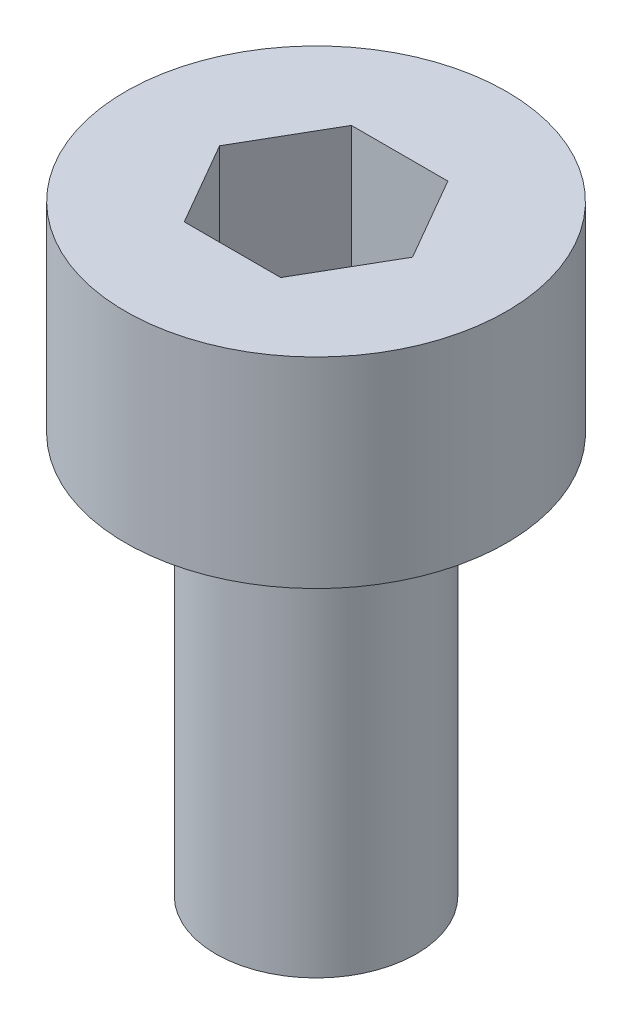
ISO-10303-21;
HEADER;
FILE_DESCRIPTION(('STEP AP214'),'2;1');
FILE_NAME('part.step','',(''),(''),'','','');
FILE_SCHEMA(('AUTOMOTIVE_DESIGN { 1 0 10303 214 1 1 1 1 }'));
ENDSEC;
DATA;
#1=APPLICATION_CONTEXT('core data for automotive mechanical design processes');
#2=APPLICATION_PROTOCOL_DEFINITION('international standard','automotive_design',2000,#1);
#3=PRODUCT_CONTEXT('',#1,'mechanical');
#4=PRODUCT('Part','Part','',(#3));
#5=PRODUCT_RELATED_PRODUCT_CATEGORY('part','',(#4));
#6=PRODUCT_DEFINITION_FORMATION('','',#4);
#7=PRODUCT_DEFINITION_CONTEXT('part definition',#1,'design');
#8=PRODUCT_DEFINITION('design','',#6,#7);
#9=PRODUCT_DEFINITION_SHAPE('','',#8);
#10=(LENGTH_UNIT() NAMED_UNIT(*) SI_UNIT(.MILLI.,.METRE.));
#11=(NAMED_UNIT(*) PLANE_ANGLE_UNIT() SI_UNIT($,.RADIAN.));
#12=(NAMED_UNIT(*) SI_UNIT($,.STERADIAN.) SOLID_ANGLE_UNIT());
#13=UNCERTAINTY_MEASURE_WITH_UNIT(LENGTH_MEASURE(1.E-05),#10,'distance_accuracy_value','');
#14=(GEOMETRIC_REPRESENTATION_CONTEXT(3) GLOBAL_UNCERTAINTY_ASSIGNED_CONTEXT((#13)) GLOBAL_UNIT_ASSIGNED_CONTEXT((#10,
#11,#12)) REPRESENTATION_CONTEXT('',''));
#15=CARTESIAN_POINT('',(0.,0.,0.));
#16=DIRECTION('',(0.,0.,1.));
#17=DIRECTION('',(1.,0.,0.));
#18=AXIS2_PLACEMENT_3D('',#15,#16,#17);
#19=CARTESIAN_POINT('',(0.,-6.,0.));
#20=DIRECTION('',(0.,-1.,0.));
#21=DIRECTION('',(0.,0.,-1.));
#22=AXIS2_PLACEMENT_3D('',#19,#20,#21);
#23=PLANE('',#22);
#24=CARTESIAN_POINT('',(0.,-6.,0.));
#25=DIRECTION('',(0.,-1.,0.));
#26=DIRECTION('',(0.,0.,-1.));
#27=AXIS2_PLACEMENT_3D('',#24,#25,#26);
#28=CIRCLE('',#27,1.5);
#29=CARTESIAN_POINT('',(0.,-6.,-1.5));
#30=VERTEX_POINT('',#29);
#31=EDGE_CURVE('E11',#30,#30,#28,.T.);
#32=ORIENTED_EDGE('',*,*,#31,.T.);
#33=EDGE_LOOP('',(#32));
#34=FACE_BOUND('',#33,.T.);
#35=ADVANCED_FACE('F36',(#34),#23,.T.);
#36=CARTESIAN_POINT('',(0.,4.,0.));
#37=DIRECTION('',(0.,-1.,0.));
#38=DIRECTION('',(0.,0.,-1.));
#39=AXIS2_PLACEMENT_3D('',#36,#37,#38);
#40=CYLINDRICAL_SURFACE('',#39,1.5);
#41=CARTESIAN_POINT('',(0.,0.,0.));
#42=DIRECTION('',(0.,-1.,0.));
#43=DIRECTION('',(0.,0.,-1.));
#44=AXIS2_PLACEMENT_3D('',#41,#42,#43);
#45=CIRCLE('',#44,1.5);
#46=CARTESIAN_POINT('',(0.,0.,-1.5));
#47=VERTEX_POINT('',#46);
#48=EDGE_CURVE('E43',#47,#47,#45,.T.);
#49=ORIENTED_EDGE('',*,*,#48,.T.);
#50=EDGE_LOOP('',(#49));
#51=FACE_BOUND('',#50,.T.);
#52=ORIENTED_EDGE('',*,*,#31,.F.);
#53=EDGE_LOOP('',(#52));
#54=FACE_BOUND('',#53,.T.);
#55=ADVANCED_FACE('F150',(#51,#54),#40,.T.);
#56=CARTESIAN_POINT('',(0.,0.,-1.5));
#57=DIRECTION('',(0.,-1.,0.));
#58=DIRECTION('',(0.,0.,-1.));
#59=AXIS2_PLACEMENT_3D('',#56,#57,#58);
#60=PLANE('',#59);
#61=CARTESIAN_POINT('',(0.,0.,0.));
#62=DIRECTION('',(0.,-1.,0.));
#63=DIRECTION('',(0.,0.,-1.));
#64=AXIS2_PLACEMENT_3D('',#61,#62,#63);
#65=CIRCLE('',#64,2.85);
#66=CARTESIAN_POINT('',(0.,0.,-2.85));
#67=VERTEX_POINT('',#66);
#68=EDGE_CURVE('E145',#67,#67,#65,.T.);
#69=ORIENTED_EDGE('',*,*,#68,.T.);
#70=EDGE_LOOP('',(#69));
#71=FACE_BOUND('',#70,.T.);
#72=ORIENTED_EDGE('',*,*,#48,.F.);
#73=EDGE_LOOP('',(#72));
#74=FACE_BOUND('',#73,.T.);
#75=ADVANCED_FACE('F153',(#71,#74),#60,.T.);
#76=CARTESIAN_POINT('',(0.,4.,0.));
#77=DIRECTION('',(0.,-1.,0.));
#78=DIRECTION('',(0.,0.,-1.));
#79=AXIS2_PLACEMENT_3D('',#76,#77,#78);
#80=CYLINDRICAL_SURFACE('',#79,2.85);
#81=CARTESIAN_POINT('',(0.,3.,0.));
#82=DIRECTION('',(0.,-1.,0.));
#83=DIRECTION('',(0.,0.,-1.));
#84=AXIS2_PLACEMENT_3D('',#81,#82,#83);
#85=CIRCLE('',#84,2.85);
#86=CARTESIAN_POINT('',(0.,3.,-2.85));
#87=VERTEX_POINT('',#86);
#88=EDGE_CURVE('E137',#87,#87,#85,.T.);
#89=ORIENTED_EDGE('',*,*,#88,.T.);
#90=EDGE_LOOP('',(#89));
#91=FACE_BOUND('',#90,.T.);
#92=ORIENTED_EDGE('',*,*,#68,.F.);
#93=EDGE_LOOP('',(#92));
#94=FACE_BOUND('',#93,.T.);
#95=ADVANCED_FACE('F155',(#91,#94),#80,.T.);
#96=CARTESIAN_POINT('',(0.,3.,-2.85));
#97=DIRECTION('',(0.,1.,0.));
#98=DIRECTION('',(0.,0.,1.));
#99=AXIS2_PLACEMENT_3D('',#96,#97,#98);
#100=PLANE('',#99);
#101=DIRECTION('',(0.5,0.,-0.866025403784439));
#102=VECTOR('',#101,1.);
#103=CARTESIAN_POINT('',(0.721687836487032,3.,1.25));
#104=LINE('',#103,#102);
#105=CARTESIAN_POINT('',(0.721687836487032,3.,1.25));
#106=VERTEX_POINT('',#105);
#107=CARTESIAN_POINT('',(1.44337567297407,3.,0.));
#108=VERTEX_POINT('',#107);
#109=EDGE_CURVE('E50',#106,#108,#104,.T.);
#110=ORIENTED_EDGE('',*,*,#109,.F.);
#111=DIRECTION('',(1.,0.,0.));
#112=VECTOR('',#111,1.);
#113=CARTESIAN_POINT('',(-0.721687836487033,3.,1.25));
#114=LINE('',#113,#112);
#115=CARTESIAN_POINT('',(-0.721687836487033,3.,1.25));
#116=VERTEX_POINT('',#115);
#117=EDGE_CURVE('E133',#116,#106,#114,.T.);
#118=ORIENTED_EDGE('',*,*,#117,.F.);
#119=DIRECTION('',(0.5,0.,0.866025403784439));
#120=VECTOR('',#119,1.);
#121=CARTESIAN_POINT('',(-1.44337567297407,3.,0.));
#122=LINE('',#121,#120);
#123=CARTESIAN_POINT('',(-1.44337567297407,3.,0.));
#124=VERTEX_POINT('',#123);
#125=EDGE_CURVE('E131',#124,#116,#122,.T.);
#126=ORIENTED_EDGE('',*,*,#125,.F.);
#127=DIRECTION('',(-0.5,0.,0.866025403784439));
#128=VECTOR('',#127,1.);
#129=CARTESIAN_POINT('',(-0.721687836487033,3.,-1.25));
#130=LINE('',#129,#128);
#131=CARTESIAN_POINT('',(-0.721687836487033,3.,-1.25));
#132=VERTEX_POINT('',#131);
#133=EDGE_CURVE('E98',#132,#124,#130,.T.);
#134=ORIENTED_EDGE('',*,*,#133,.F.);
#135=DIRECTION('',(-1.,0.,0.));
#136=VECTOR('',#135,1.);
#137=CARTESIAN_POINT('',(0.721687836487033,3.,-1.25));
#138=LINE('',#137,#136);
#139=CARTESIAN_POINT('',(0.721687836487033,3.,-1.25));
#140=VERTEX_POINT('',#139);
#141=EDGE_CURVE('E127',#140,#132,#138,.T.);
#142=ORIENTED_EDGE('',*,*,#141,.F.);
#143=DIRECTION('',(-0.5,0.,-0.866025403784439));
#144=VECTOR('',#143,1.);
#145=CARTESIAN_POINT('',(1.44337567297407,3.,0.));
#146=LINE('',#145,#144);
#147=EDGE_CURVE('E124',#108,#140,#146,.T.);
#148=ORIENTED_EDGE('',*,*,#147,.F.);
#149=EDGE_LOOP('',(#110,#118,#126,#134,#142,#148));
#150=FACE_BOUND('',#149,.T.);
#151=ORIENTED_EDGE('',*,*,#88,.F.);
#152=EDGE_LOOP('',(#151));
#153=FACE_BOUND('',#152,.T.);
#154=ADVANCED_FACE('F162',(#150,#153),#100,.T.);
#155=CARTESIAN_POINT('',(0.721687836487032,0.999999999999999,1.25));
#156=DIRECTION('',(0.866025403784439,0.,0.5));
#157=DIRECTION('',(0.5,0.,-0.866025403784439));
#158=AXIS2_PLACEMENT_3D('',#155,#156,#157);
#159=PLANE('',#158);
#160=ORIENTED_EDGE('',*,*,#109,.T.);
#161=DIRECTION('',(0.,1.,0.));
#162=VECTOR('',#161,1.);
#163=CARTESIAN_POINT('',(1.44337567297407,0.999999999999999,0.));
#164=LINE('',#163,#162);
#165=CARTESIAN_POINT('',(1.44337567297407,0.999999999999999,0.));
#166=VERTEX_POINT('',#165);
#167=EDGE_CURVE('E80',#166,#108,#164,.T.);
#168=ORIENTED_EDGE('',*,*,#167,.F.);
#169=DIRECTION('',(0.5,0.,-0.866025403784439));
#170=VECTOR('',#169,1.);
#171=CARTESIAN_POINT('',(0.721687836487032,0.999999999999999,1.25));
#172=LINE('',#171,#170);
#173=CARTESIAN_POINT('',(0.721687836487032,0.999999999999999,1.25));
#174=VERTEX_POINT('',#173);
#175=EDGE_CURVE('E135',#174,#166,#172,.T.);
#176=ORIENTED_EDGE('',*,*,#175,.F.);
#177=DIRECTION('',(0.,1.,0.));
#178=VECTOR('',#177,1.);
#179=CARTESIAN_POINT('',(0.721687836487032,0.999999999999999,1.25));
#180=LINE('',#179,#178);
#181=EDGE_CURVE('E58',#174,#106,#180,.T.);
#182=ORIENTED_EDGE('',*,*,#181,.T.);
#183=EDGE_LOOP('',(#160,#168,#176,#182));
#184=FACE_BOUND('',#183,.T.);
#185=ADVANCED_FACE('F193',(#184),#159,.F.);
#186=CARTESIAN_POINT('',(-0.721687836487033,0.999999999999999,1.25));
#187=DIRECTION('',(0.,0.,1.));
#188=DIRECTION('',(1.,0.,0.));
#189=AXIS2_PLACEMENT_3D('',#186,#187,#188);
#190=PLANE('',#189);
#191=ORIENTED_EDGE('',*,*,#117,.T.);
#192=ORIENTED_EDGE('',*,*,#181,.F.);
#193=DIRECTION('',(1.,0.,0.));
#194=VECTOR('',#193,1.);
#195=CARTESIAN_POINT('',(-0.721687836487033,0.999999999999999,1.25));
#196=LINE('',#195,#194);
#197=CARTESIAN_POINT('',(-0.721687836487033,0.999999999999999,1.25));
#198=VERTEX_POINT('',#197);
#199=EDGE_CURVE('E110',#198,#174,#196,.T.);
#200=ORIENTED_EDGE('',*,*,#199,.F.);
#201=DIRECTION('',(0.,1.,0.));
#202=VECTOR('',#201,1.);
#203=CARTESIAN_POINT('',(-0.721687836487033,0.999999999999999,1.25));
#204=LINE('',#203,#202);
#205=EDGE_CURVE('E102',#198,#116,#204,.T.);
#206=ORIENTED_EDGE('',*,*,#205,.T.);
#207=EDGE_LOOP('',(#191,#192,#200,#206));
#208=FACE_BOUND('',#207,.T.);
#209=ADVANCED_FACE('F203',(#208),#190,.F.);
#210=CARTESIAN_POINT('',(-1.44337567297407,0.999999999999999,0.));
#211=DIRECTION('',(-0.866025403784439,0.,0.5));
#212=DIRECTION('',(0.5,0.,0.866025403784439));
#213=AXIS2_PLACEMENT_3D('',#210,#211,#212);
#214=PLANE('',#213);
#215=ORIENTED_EDGE('',*,*,#125,.T.);
#216=ORIENTED_EDGE('',*,*,#205,.F.);
#217=DIRECTION('',(0.5,0.,0.866025403784439));
#218=VECTOR('',#217,1.);
#219=CARTESIAN_POINT('',(-1.44337567297407,0.999999999999999,0.));
#220=LINE('',#219,#218);
#221=CARTESIAN_POINT('',(-1.44337567297407,0.999999999999999,0.));
#222=VERTEX_POINT('',#221);
#223=EDGE_CURVE('E106',#222,#198,#220,.T.);
#224=ORIENTED_EDGE('',*,*,#223,.F.);
#225=DIRECTION('',(0.,1.,0.));
#226=VECTOR('',#225,1.);
#227=CARTESIAN_POINT('',(-1.44337567297407,0.999999999999999,0.));
#228=LINE('',#227,#226);
#229=EDGE_CURVE('E91',#222,#124,#228,.T.);
#230=ORIENTED_EDGE('',*,*,#229,.T.);
#231=EDGE_LOOP('',(#215,#216,#224,#230));
#232=FACE_BOUND('',#231,.T.);
#233=ADVANCED_FACE('F107',(#232),#214,.F.);
#234=CARTESIAN_POINT('',(-0.721687836487033,0.999999999999999,-1.25));
#235=DIRECTION('',(-0.866025403784439,0.,-0.5));
#236=DIRECTION('',(-0.5,0.,0.866025403784439));
#237=AXIS2_PLACEMENT_3D('',#234,#235,#236);
#238=PLANE('',#237);
#239=ORIENTED_EDGE('',*,*,#133,.T.);
#240=ORIENTED_EDGE('',*,*,#229,.F.);
#241=DIRECTION('',(-0.5,0.,0.866025403784439));
#242=VECTOR('',#241,1.);
#243=CARTESIAN_POINT('',(-0.721687836487033,0.999999999999999,-1.25));
#244=LINE('',#243,#242);
#245=CARTESIAN_POINT('',(-0.721687836487033,0.999999999999999,-1.25));
#246=VERTEX_POINT('',#245);
#247=EDGE_CURVE('E95',#246,#222,#244,.T.);
#248=ORIENTED_EDGE('',*,*,#247,.F.);
#249=DIRECTION('',(0.,1.,0.));
#250=VECTOR('',#249,1.);
#251=CARTESIAN_POINT('',(-0.721687836487033,0.999999999999999,-1.25));
#252=LINE('',#251,#250);
#253=EDGE_CURVE('E103',#246,#132,#252,.T.);
#254=ORIENTED_EDGE('',*,*,#253,.T.);
#255=EDGE_LOOP('',(#239,#240,#248,#254));
#256=FACE_BOUND('',#255,.T.);
#257=ADVANCED_FACE('F93',(#256),#238,.F.);
#258=CARTESIAN_POINT('',(0.721687836487033,0.999999999999999,-1.25));
#259=DIRECTION('',(0.,0.,-1.));
#260=DIRECTION('',(-1.,0.,0.));
#261=AXIS2_PLACEMENT_3D('',#258,#259,#260);
#262=PLANE('',#261);
#263=ORIENTED_EDGE('',*,*,#141,.T.);
#264=ORIENTED_EDGE('',*,*,#253,.F.);
#265=DIRECTION('',(-1.,0.,0.));
#266=VECTOR('',#265,1.);
#267=CARTESIAN_POINT('',(0.721687836487033,0.999999999999999,-1.25));
#268=LINE('',#267,#266);
#269=CARTESIAN_POINT('',(0.721687836487033,0.999999999999999,-1.25));
#270=VERTEX_POINT('',#269);
#271=EDGE_CURVE('E116',#270,#246,#268,.T.);
#272=ORIENTED_EDGE('',*,*,#271,.F.);
#273=DIRECTION('',(0.,1.,0.));
#274=VECTOR('',#273,1.);
#275=CARTESIAN_POINT('',(0.721687836487033,0.999999999999999,-1.25));
#276=LINE('',#275,#274);
#277=EDGE_CURVE('E140',#270,#140,#276,.T.);
#278=ORIENTED_EDGE('',*,*,#277,.T.);
#279=EDGE_LOOP('',(#263,#264,#272,#278));
#280=FACE_BOUND('',#279,.T.);
#281=ADVANCED_FACE('F228',(#280),#262,.F.);
#282=CARTESIAN_POINT('',(1.44337567297407,0.999999999999999,0.));
#283=DIRECTION('',(0.866025403784439,0.,-0.5));
#284=DIRECTION('',(-0.5,0.,-0.866025403784439));
#285=AXIS2_PLACEMENT_3D('',#282,#283,#284);
#286=PLANE('',#285);
#287=ORIENTED_EDGE('',*,*,#147,.T.);
#288=ORIENTED_EDGE('',*,*,#277,.F.);
#289=DIRECTION('',(-0.5,0.,-0.866025403784439));
#290=VECTOR('',#289,1.);
#291=CARTESIAN_POINT('',(1.44337567297407,0.999999999999999,0.));
#292=LINE('',#291,#290);
#293=EDGE_CURVE('E118',#166,#270,#292,.T.);
#294=ORIENTED_EDGE('',*,*,#293,.F.);
#295=ORIENTED_EDGE('',*,*,#167,.T.);
#296=EDGE_LOOP('',(#287,#288,#294,#295));
#297=FACE_BOUND('',#296,.T.);
#298=ADVANCED_FACE('F237',(#297),#286,.F.);
#299=CARTESIAN_POINT('',(0.,0.999999999999999,0.));
#300=DIRECTION('',(0.,1.,0.));
#301=DIRECTION('',(0.,0.,1.));
#302=AXIS2_PLACEMENT_3D('',#299,#300,#301);
#303=PLANE('',#302);
#304=ORIENTED_EDGE('',*,*,#175,.T.);
#305=ORIENTED_EDGE('',*,*,#293,.T.);
#306=ORIENTED_EDGE('',*,*,#271,.T.);
#307=ORIENTED_EDGE('',*,*,#247,.T.);
#308=ORIENTED_EDGE('',*,*,#223,.T.);
#309=ORIENTED_EDGE('',*,*,#199,.T.);
#310=EDGE_LOOP('',(#304,#305,#306,#307,#308,#309));
#311=FACE_BOUND('',#310,.T.);
#312=ADVANCED_FACE('F113',(#311),#303,.T.);
#313=CLOSED_SHELL('',(#35,#55,#75,#95,#154,#185,#209,#233,#257,#281,#298,#312));
#314=MANIFOLD_SOLID_BREP('B2',#313);
#315=ADVANCED_BREP_SHAPE_REPRESENTATION('',(#18,#314),#14);
#316=SHAPE_DEFINITION_REPRESENTATION(#9,#315);
ENDSEC;
END-ISO-10303-21;
